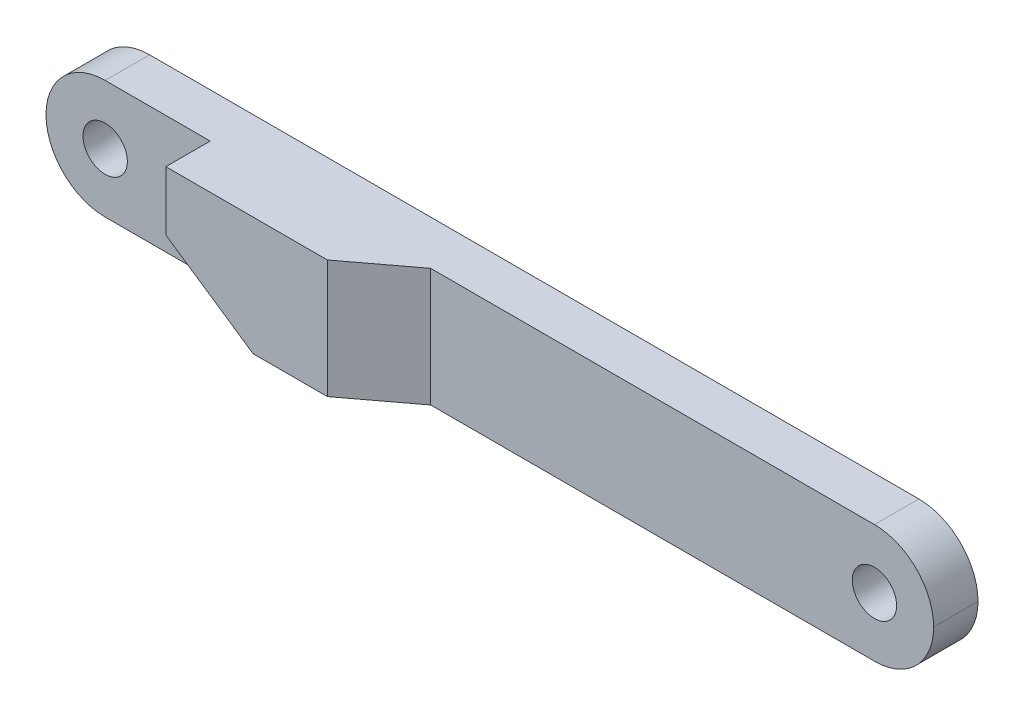
ISO-10303-21;
HEADER;
FILE_DESCRIPTION(('STEP AP214'),'2;1');
FILE_NAME('part.step','',(''),(''),'','','');
FILE_SCHEMA(('AUTOMOTIVE_DESIGN { 1 0 10303 214 1 1 1 1 }'));
ENDSEC;
DATA;
#1=APPLICATION_CONTEXT('core data for automotive mechanical design processes');
#2=APPLICATION_PROTOCOL_DEFINITION('international standard','automotive_design',2000,#1);
#3=PRODUCT_CONTEXT('',#1,'mechanical');
#4=PRODUCT('Part','Part','',(#3));
#5=PRODUCT_RELATED_PRODUCT_CATEGORY('part','',(#4));
#6=PRODUCT_DEFINITION_FORMATION('','',#4);
#7=PRODUCT_DEFINITION_CONTEXT('part definition',#1,'design');
#8=PRODUCT_DEFINITION('design','',#6,#7);
#9=PRODUCT_DEFINITION_SHAPE('','',#8);
#10=(LENGTH_UNIT() NAMED_UNIT(*) SI_UNIT(.MILLI.,.METRE.));
#11=(NAMED_UNIT(*) PLANE_ANGLE_UNIT() SI_UNIT($,.RADIAN.));
#12=(NAMED_UNIT(*) SI_UNIT($,.STERADIAN.) SOLID_ANGLE_UNIT());
#13=UNCERTAINTY_MEASURE_WITH_UNIT(LENGTH_MEASURE(1.E-05),#10,'distance_accuracy_value','');
#14=(GEOMETRIC_REPRESENTATION_CONTEXT(3) GLOBAL_UNCERTAINTY_ASSIGNED_CONTEXT((#13)) GLOBAL_UNIT_ASSIGNED_CONTEXT((#10,
#11,#12)) REPRESENTATION_CONTEXT('',''));
#15=CARTESIAN_POINT('',(0.,0.,0.));
#16=DIRECTION('',(0.,0.,1.));
#17=DIRECTION('',(1.,0.,0.));
#18=AXIS2_PLACEMENT_3D('',#15,#16,#17);
#19=CARTESIAN_POINT('',(0.,0.,3.));
#20=DIRECTION('',(0.,0.,-1.));
#21=DIRECTION('',(-1.,0.,0.));
#22=AXIS2_PLACEMENT_3D('',#19,#20,#21);
#23=PLANE('',#22);
#24=CARTESIAN_POINT('',(56.,4.,3.));
#25=DIRECTION('',(0.,0.,1.));
#26=DIRECTION('',(1.,0.,0.));
#27=AXIS2_PLACEMENT_3D('',#24,#25,#26);
#28=CIRCLE('',#27,1.5);
#29=CARTESIAN_POINT('',(57.5,4.,3.));
#30=VERTEX_POINT('',#29);
#31=EDGE_CURVE('E151',#30,#30,#28,.T.);
#32=ORIENTED_EDGE('',*,*,#31,.F.);
#33=EDGE_LOOP('',(#32));
#34=FACE_BOUND('',#33,.T.);
#35=DIRECTION('',(-1.,0.,0.));
#36=VECTOR('',#35,1.);
#37=CARTESIAN_POINT('',(0.,8.,3.));
#38=LINE('',#37,#36);
#39=CARTESIAN_POINT('',(56.,8.,3.));
#40=VERTEX_POINT('',#39);
#41=CARTESIAN_POINT('',(26.,8.,3.));
#42=VERTEX_POINT('',#41);
#43=EDGE_CURVE('E167',#40,#42,#38,.T.);
#44=ORIENTED_EDGE('',*,*,#43,.T.);
#45=DIRECTION('',(0.,-1.,0.));
#46=VECTOR('',#45,1.);
#47=CARTESIAN_POINT('',(26.,0.,3.));
#48=LINE('',#47,#46);
#49=CARTESIAN_POINT('',(26.,0.,3.));
#50=VERTEX_POINT('',#49);
#51=EDGE_CURVE('E203',#42,#50,#48,.T.);
#52=ORIENTED_EDGE('',*,*,#51,.T.);
#53=DIRECTION('',(1.,0.,0.));
#54=VECTOR('',#53,1.);
#55=CARTESIAN_POINT('',(0.,0.,3.));
#56=LINE('',#55,#54);
#57=CARTESIAN_POINT('',(56.,0.,3.));
#58=VERTEX_POINT('',#57);
#59=EDGE_CURVE('E166',#50,#58,#56,.T.);
#60=ORIENTED_EDGE('',*,*,#59,.T.);
#61=CARTESIAN_POINT('',(56.,4.,3.));
#62=DIRECTION('',(0.,0.,-1.));
#63=DIRECTION('',(-1.,0.,0.));
#64=AXIS2_PLACEMENT_3D('',#61,#62,#63);
#65=CIRCLE('',#64,4.);
#66=CARTESIAN_POINT('',(60.,4.,3.));
#67=VERTEX_POINT('',#66);
#68=EDGE_CURVE('E196',#58,#67,#65,.F.);
#69=ORIENTED_EDGE('',*,*,#68,.T.);
#70=CARTESIAN_POINT('',(56.,4.,3.));
#71=DIRECTION('',(0.,0.,-1.));
#72=DIRECTION('',(-1.,0.,0.));
#73=AXIS2_PLACEMENT_3D('',#70,#71,#72);
#74=CIRCLE('',#73,4.);
#75=EDGE_CURVE('E194',#67,#40,#74,.F.);
#76=ORIENTED_EDGE('',*,*,#75,.T.);
#77=EDGE_LOOP('',(#44,#52,#60,#69,#76));
#78=FACE_BOUND('',#77,.T.);
#79=ADVANCED_FACE('F39',(#34,#78),#23,.F.);
#80=CARTESIAN_POINT('',(4.,4.,3.));
#81=DIRECTION('',(0.,0.,1.));
#82=DIRECTION('',(1.,0.,0.));
#83=AXIS2_PLACEMENT_3D('',#80,#81,#82);
#84=CIRCLE('',#83,1.5);
#85=CARTESIAN_POINT('',(5.5,4.,3.));
#86=VERTEX_POINT('',#85);
#87=EDGE_CURVE('E156',#86,#86,#84,.T.);
#88=ORIENTED_EDGE('',*,*,#87,.F.);
#89=EDGE_LOOP('',(#88));
#90=FACE_BOUND('',#89,.T.);
#91=DIRECTION('',(0.827708498204769,-0.56115830386764,0.));
#92=VECTOR('',#91,1.);
#93=CARTESIAN_POINT('',(5.2,8.,3.));
#94=LINE('',#93,#92);
#95=CARTESIAN_POINT('',(11.1,4.,3.));
#96=VERTEX_POINT('',#95);
#97=CARTESIAN_POINT('',(17.,0.,3.));
#98=VERTEX_POINT('',#97);
#99=EDGE_CURVE('E133',#96,#98,#94,.T.);
#100=ORIENTED_EDGE('',*,*,#99,.F.);
#101=DIRECTION('',(0.,1.,0.));
#102=VECTOR('',#101,1.);
#103=CARTESIAN_POINT('',(11.1,4.,3.));
#104=LINE('',#103,#102);
#105=CARTESIAN_POINT('',(11.1,8.,3.));
#106=VERTEX_POINT('',#105);
#107=EDGE_CURVE('E121',#96,#106,#104,.T.);
#108=ORIENTED_EDGE('',*,*,#107,.T.);
#109=CARTESIAN_POINT('',(4.,8.,3.));
#110=VERTEX_POINT('',#109);
#111=EDGE_CURVE('E165',#106,#110,#38,.T.);
#112=ORIENTED_EDGE('',*,*,#111,.T.);
#113=CARTESIAN_POINT('',(4.,4.,3.));
#114=DIRECTION('',(0.,0.,-1.));
#115=DIRECTION('',(-1.,0.,0.));
#116=AXIS2_PLACEMENT_3D('',#113,#114,#115);
#117=CIRCLE('',#116,4.);
#118=CARTESIAN_POINT('',(0.,4.,3.));
#119=VERTEX_POINT('',#118);
#120=EDGE_CURVE('E192',#110,#119,#117,.F.);
#121=ORIENTED_EDGE('',*,*,#120,.T.);
#122=CARTESIAN_POINT('',(4.,4.,3.));
#123=DIRECTION('',(0.,0.,-1.));
#124=DIRECTION('',(-1.,0.,0.));
#125=AXIS2_PLACEMENT_3D('',#122,#123,#124);
#126=CIRCLE('',#125,4.);
#127=CARTESIAN_POINT('',(4.,0.,3.));
#128=VERTEX_POINT('',#127);
#129=EDGE_CURVE('E190',#119,#128,#126,.F.);
#130=ORIENTED_EDGE('',*,*,#129,.T.);
#131=EDGE_CURVE('E139',#128,#98,#56,.T.);
#132=ORIENTED_EDGE('',*,*,#131,.T.);
#133=EDGE_LOOP('',(#100,#108,#112,#121,#130,#132));
#134=FACE_BOUND('',#133,.T.);
#135=ADVANCED_FACE('F137',(#90,#134),#23,.F.);
#136=CARTESIAN_POINT('',(0.,0.,3.));
#137=DIRECTION('',(0.,1.,0.));
#138=DIRECTION('',(0.,0.,1.));
#139=AXIS2_PLACEMENT_3D('',#136,#137,#138);
#140=PLANE('',#139);
#141=DIRECTION('',(1.,0.,0.));
#142=VECTOR('',#141,1.);
#143=CARTESIAN_POINT('',(0.,0.,0.));
#144=LINE('',#143,#142);
#145=CARTESIAN_POINT('',(4.,0.,0.));
#146=VERTEX_POINT('',#145);
#147=CARTESIAN_POINT('',(56.,0.,0.));
#148=VERTEX_POINT('',#147);
#149=EDGE_CURVE('E171',#146,#148,#144,.T.);
#150=ORIENTED_EDGE('',*,*,#149,.T.);
#151=DIRECTION('',(0.,0.,-1.));
#152=VECTOR('',#151,1.);
#153=CARTESIAN_POINT('',(56.,0.,3.));
#154=LINE('',#153,#152);
#155=EDGE_CURVE('E187',#148,#58,#154,.F.);
#156=ORIENTED_EDGE('',*,*,#155,.T.);
#157=ORIENTED_EDGE('',*,*,#59,.F.);
#158=DIRECTION('',(0.798635510047289,0.,-0.601815023152053));
#159=VECTOR('',#158,1.);
#160=CARTESIAN_POINT('',(9.41671437437917,0.,15.4964020471982));
#161=LINE('',#160,#159);
#162=CARTESIAN_POINT('',(22.0188655351388,0.,6.));
#163=VERTEX_POINT('',#162);
#164=EDGE_CURVE('E11',#50,#163,#161,.F.);
#165=ORIENTED_EDGE('',*,*,#164,.T.);
#166=DIRECTION('',(1.,0.,0.));
#167=VECTOR('',#166,1.);
#168=CARTESIAN_POINT('',(17.,0.,6.));
#169=LINE('',#168,#167);
#170=CARTESIAN_POINT('',(17.,0.,6.));
#171=VERTEX_POINT('',#170);
#172=EDGE_CURVE('E62',#171,#163,#169,.T.);
#173=ORIENTED_EDGE('',*,*,#172,.F.);
#174=DIRECTION('',(0.,0.,-1.));
#175=VECTOR('',#174,1.);
#176=CARTESIAN_POINT('',(17.,0.,6.));
#177=LINE('',#176,#175);
#178=EDGE_CURVE('E149',#171,#98,#177,.T.);
#179=ORIENTED_EDGE('',*,*,#178,.T.);
#180=ORIENTED_EDGE('',*,*,#131,.F.);
#181=DIRECTION('',(0.,0.,-1.));
#182=VECTOR('',#181,1.);
#183=CARTESIAN_POINT('',(4.,0.,3.));
#184=LINE('',#183,#182);
#185=EDGE_CURVE('E185',#128,#146,#184,.T.);
#186=ORIENTED_EDGE('',*,*,#185,.T.);
#187=EDGE_LOOP('',(#150,#156,#157,#165,#173,#179,#180,#186));
#188=FACE_BOUND('',#187,.T.);
#189=ADVANCED_FACE('F223',(#188),#140,.F.);
#190=CARTESIAN_POINT('',(0.,8.,3.));
#191=DIRECTION('',(0.,-1.,0.));
#192=DIRECTION('',(0.,0.,-1.));
#193=AXIS2_PLACEMENT_3D('',#190,#191,#192);
#194=PLANE('',#193);
#195=ORIENTED_EDGE('',*,*,#111,.F.);
#196=DIRECTION('',(0.,0.,1.));
#197=VECTOR('',#196,1.);
#198=CARTESIAN_POINT('',(11.1,8.,3.));
#199=LINE('',#198,#197);
#200=CARTESIAN_POINT('',(11.1,8.,6.));
#201=VERTEX_POINT('',#200);
#202=EDGE_CURVE('E124',#106,#201,#199,.T.);
#203=ORIENTED_EDGE('',*,*,#202,.T.);
#204=DIRECTION('',(-1.,0.,0.));
#205=VECTOR('',#204,1.);
#206=CARTESIAN_POINT('',(22.,8.,6.));
#207=LINE('',#206,#205);
#208=CARTESIAN_POINT('',(22.0188655351388,8.,6.));
#209=VERTEX_POINT('',#208);
#210=EDGE_CURVE('E141',#209,#201,#207,.T.);
#211=ORIENTED_EDGE('',*,*,#210,.F.);
#212=DIRECTION('',(-0.798635510047289,0.,0.601815023152053));
#213=VECTOR('',#212,1.);
#214=CARTESIAN_POINT('',(9.41671437437917,8.,15.4964020471982));
#215=LINE('',#214,#213);
#216=EDGE_CURVE('E47',#209,#42,#215,.F.);
#217=ORIENTED_EDGE('',*,*,#216,.T.);
#218=ORIENTED_EDGE('',*,*,#43,.F.);
#219=DIRECTION('',(0.,0.,-1.));
#220=VECTOR('',#219,1.);
#221=CARTESIAN_POINT('',(56.,8.,3.));
#222=LINE('',#221,#220);
#223=CARTESIAN_POINT('',(56.,8.,0.));
#224=VERTEX_POINT('',#223);
#225=EDGE_CURVE('E201',#40,#224,#222,.T.);
#226=ORIENTED_EDGE('',*,*,#225,.T.);
#227=DIRECTION('',(-1.,0.,0.));
#228=VECTOR('',#227,1.);
#229=CARTESIAN_POINT('',(0.,8.,0.));
#230=LINE('',#229,#228);
#231=CARTESIAN_POINT('',(4.,8.,0.));
#232=VERTEX_POINT('',#231);
#233=EDGE_CURVE('E174',#224,#232,#230,.T.);
#234=ORIENTED_EDGE('',*,*,#233,.T.);
#235=DIRECTION('',(0.,0.,-1.));
#236=VECTOR('',#235,1.);
#237=CARTESIAN_POINT('',(4.,8.,3.));
#238=LINE('',#237,#236);
#239=EDGE_CURVE('E198',#232,#110,#238,.F.);
#240=ORIENTED_EDGE('',*,*,#239,.T.);
#241=EDGE_LOOP('',(#195,#203,#211,#217,#218,#226,#234,#240));
#242=FACE_BOUND('',#241,.T.);
#243=ADVANCED_FACE('F214',(#242),#194,.F.);
#244=CARTESIAN_POINT('',(0.,0.,0.));
#245=DIRECTION('',(0.,0.,-1.));
#246=DIRECTION('',(-1.,0.,0.));
#247=AXIS2_PLACEMENT_3D('',#244,#245,#246);
#248=PLANE('',#247);
#249=CARTESIAN_POINT('',(4.,4.,0.));
#250=DIRECTION('',(0.,0.,1.));
#251=DIRECTION('',(1.,0.,0.));
#252=AXIS2_PLACEMENT_3D('',#249,#250,#251);
#253=CIRCLE('',#252,1.5);
#254=CARTESIAN_POINT('',(5.5,4.,0.));
#255=VERTEX_POINT('',#254);
#256=EDGE_CURVE('E152',#255,#255,#253,.T.);
#257=ORIENTED_EDGE('',*,*,#256,.T.);
#258=EDGE_LOOP('',(#257));
#259=FACE_BOUND('',#258,.T.);
#260=CARTESIAN_POINT('',(56.,4.,0.));
#261=DIRECTION('',(0.,0.,1.));
#262=DIRECTION('',(1.,0.,0.));
#263=AXIS2_PLACEMENT_3D('',#260,#261,#262);
#264=CIRCLE('',#263,1.5);
#265=CARTESIAN_POINT('',(57.5,4.,0.));
#266=VERTEX_POINT('',#265);
#267=EDGE_CURVE('E159',#266,#266,#264,.T.);
#268=ORIENTED_EDGE('',*,*,#267,.T.);
#269=EDGE_LOOP('',(#268));
#270=FACE_BOUND('',#269,.T.);
#271=CARTESIAN_POINT('',(56.,4.,0.));
#272=DIRECTION('',(0.,0.,-1.));
#273=DIRECTION('',(-1.,0.,0.));
#274=AXIS2_PLACEMENT_3D('',#271,#272,#273);
#275=CIRCLE('',#274,4.);
#276=CARTESIAN_POINT('',(60.,4.,0.));
#277=VERTEX_POINT('',#276);
#278=EDGE_CURVE('E181',#224,#277,#275,.T.);
#279=ORIENTED_EDGE('',*,*,#278,.T.);
#280=CARTESIAN_POINT('',(56.,4.,0.));
#281=DIRECTION('',(0.,0.,-1.));
#282=DIRECTION('',(-1.,0.,0.));
#283=AXIS2_PLACEMENT_3D('',#280,#281,#282);
#284=CIRCLE('',#283,4.);
#285=EDGE_CURVE('E183',#277,#148,#284,.T.);
#286=ORIENTED_EDGE('',*,*,#285,.T.);
#287=ORIENTED_EDGE('',*,*,#149,.F.);
#288=CARTESIAN_POINT('',(4.,4.,0.));
#289=DIRECTION('',(0.,0.,-1.));
#290=DIRECTION('',(-1.,0.,0.));
#291=AXIS2_PLACEMENT_3D('',#288,#289,#290);
#292=CIRCLE('',#291,4.);
#293=CARTESIAN_POINT('',(0.,4.,0.));
#294=VERTEX_POINT('',#293);
#295=EDGE_CURVE('E170',#146,#294,#292,.T.);
#296=ORIENTED_EDGE('',*,*,#295,.T.);
#297=CARTESIAN_POINT('',(4.,4.,0.));
#298=DIRECTION('',(0.,0.,-1.));
#299=DIRECTION('',(-1.,0.,0.));
#300=AXIS2_PLACEMENT_3D('',#297,#298,#299);
#301=CIRCLE('',#300,4.);
#302=EDGE_CURVE('E179',#294,#232,#301,.T.);
#303=ORIENTED_EDGE('',*,*,#302,.T.);
#304=ORIENTED_EDGE('',*,*,#233,.F.);
#305=EDGE_LOOP('',(#279,#286,#287,#296,#303,#304));
#306=FACE_BOUND('',#305,.T.);
#307=ADVANCED_FACE('F236',(#259,#270,#306),#248,.T.);
#308=CARTESIAN_POINT('',(56.,4.,3.));
#309=DIRECTION('',(0.,0.,-1.));
#310=DIRECTION('',(-1.,0.,0.));
#311=AXIS2_PLACEMENT_3D('',#308,#309,#310);
#312=CYLINDRICAL_SURFACE('',#311,4.);
#313=ORIENTED_EDGE('',*,*,#225,.F.);
#314=ORIENTED_EDGE('',*,*,#75,.F.);
#315=DIRECTION('',(0.,0.,-1.));
#316=VECTOR('',#315,1.);
#317=CARTESIAN_POINT('',(60.,4.,3.));
#318=LINE('',#317,#316);
#319=EDGE_CURVE('E175',#277,#67,#318,.F.);
#320=ORIENTED_EDGE('',*,*,#319,.F.);
#321=ORIENTED_EDGE('',*,*,#278,.F.);
#322=EDGE_LOOP('',(#313,#314,#320,#321));
#323=FACE_BOUND('',#322,.T.);
#324=ADVANCED_FACE('F232',(#323),#312,.T.);
#325=CARTESIAN_POINT('',(56.,4.,3.));
#326=DIRECTION('',(0.,0.,-1.));
#327=DIRECTION('',(-1.,0.,0.));
#328=AXIS2_PLACEMENT_3D('',#325,#326,#327);
#329=CYLINDRICAL_SURFACE('',#328,4.);
#330=ORIENTED_EDGE('',*,*,#68,.F.);
#331=ORIENTED_EDGE('',*,*,#155,.F.);
#332=ORIENTED_EDGE('',*,*,#285,.F.);
#333=ORIENTED_EDGE('',*,*,#319,.T.);
#334=EDGE_LOOP('',(#330,#331,#332,#333));
#335=FACE_BOUND('',#334,.T.);
#336=ADVANCED_FACE('F227',(#335),#329,.T.);
#337=CARTESIAN_POINT('',(4.,4.,3.));
#338=DIRECTION('',(0.,0.,-1.));
#339=DIRECTION('',(-1.,0.,0.));
#340=AXIS2_PLACEMENT_3D('',#337,#338,#339);
#341=CYLINDRICAL_SURFACE('',#340,4.);
#342=ORIENTED_EDGE('',*,*,#185,.F.);
#343=ORIENTED_EDGE('',*,*,#129,.F.);
#344=DIRECTION('',(0.,0.,-1.));
#345=VECTOR('',#344,1.);
#346=CARTESIAN_POINT('',(0.,4.,3.));
#347=LINE('',#346,#345);
#348=EDGE_CURVE('E155',#294,#119,#347,.F.);
#349=ORIENTED_EDGE('',*,*,#348,.F.);
#350=ORIENTED_EDGE('',*,*,#295,.F.);
#351=EDGE_LOOP('',(#342,#343,#349,#350));
#352=FACE_BOUND('',#351,.T.);
#353=ADVANCED_FACE('F247',(#352),#341,.T.);
#354=CARTESIAN_POINT('',(4.,4.,3.));
#355=DIRECTION('',(0.,0.,-1.));
#356=DIRECTION('',(-1.,0.,0.));
#357=AXIS2_PLACEMENT_3D('',#354,#355,#356);
#358=CYLINDRICAL_SURFACE('',#357,4.);
#359=ORIENTED_EDGE('',*,*,#120,.F.);
#360=ORIENTED_EDGE('',*,*,#239,.F.);
#361=ORIENTED_EDGE('',*,*,#302,.F.);
#362=ORIENTED_EDGE('',*,*,#348,.T.);
#363=EDGE_LOOP('',(#359,#360,#361,#362));
#364=FACE_BOUND('',#363,.T.);
#365=ADVANCED_FACE('F243',(#364),#358,.T.);
#366=CARTESIAN_POINT('',(56.,4.,0.));
#367=DIRECTION('',(0.,0.,1.));
#368=DIRECTION('',(1.,0.,0.));
#369=AXIS2_PLACEMENT_3D('',#366,#367,#368);
#370=CYLINDRICAL_SURFACE('',#369,1.5);
#371=ORIENTED_EDGE('',*,*,#267,.F.);
#372=EDGE_LOOP('',(#371));
#373=FACE_BOUND('',#372,.T.);
#374=ORIENTED_EDGE('',*,*,#31,.T.);
#375=EDGE_LOOP('',(#374));
#376=FACE_BOUND('',#375,.T.);
#377=ADVANCED_FACE('F253',(#373,#376),#370,.F.);
#378=CARTESIAN_POINT('',(4.,4.,0.));
#379=DIRECTION('',(0.,0.,1.));
#380=DIRECTION('',(1.,0.,0.));
#381=AXIS2_PLACEMENT_3D('',#378,#379,#380);
#382=CYLINDRICAL_SURFACE('',#381,1.5);
#383=ORIENTED_EDGE('',*,*,#256,.F.);
#384=EDGE_LOOP('',(#383));
#385=FACE_BOUND('',#384,.T.);
#386=ORIENTED_EDGE('',*,*,#87,.T.);
#387=EDGE_LOOP('',(#386));
#388=FACE_BOUND('',#387,.T.);
#389=ADVANCED_FACE('F308',(#385,#388),#382,.F.);
#390=CARTESIAN_POINT('',(5.2,8.,6.));
#391=DIRECTION('',(0.56115830386764,0.827708498204769,0.));
#392=DIRECTION('',(-0.827708498204769,0.56115830386764,0.));
#393=AXIS2_PLACEMENT_3D('',#390,#391,#392);
#394=PLANE('',#393);
#395=DIRECTION('',(0.827708498204769,-0.56115830386764,0.));
#396=VECTOR('',#395,1.);
#397=CARTESIAN_POINT('',(5.2,8.,6.));
#398=LINE('',#397,#396);
#399=CARTESIAN_POINT('',(11.1,4.,6.));
#400=VERTEX_POINT('',#399);
#401=EDGE_CURVE('E135',#400,#171,#398,.T.);
#402=ORIENTED_EDGE('',*,*,#401,.F.);
#403=DIRECTION('',(0.,0.,1.));
#404=VECTOR('',#403,1.);
#405=CARTESIAN_POINT('',(11.1,4.,3.));
#406=LINE('',#405,#404);
#407=EDGE_CURVE('E54',#96,#400,#406,.T.);
#408=ORIENTED_EDGE('',*,*,#407,.F.);
#409=ORIENTED_EDGE('',*,*,#99,.T.);
#410=ORIENTED_EDGE('',*,*,#178,.F.);
#411=EDGE_LOOP('',(#402,#408,#409,#410));
#412=FACE_BOUND('',#411,.T.);
#413=ADVANCED_FACE('F131',(#412),#394,.F.);
#414=CARTESIAN_POINT('',(0.,0.,6.));
#415=DIRECTION('',(0.,0.,-1.));
#416=DIRECTION('',(-1.,0.,0.));
#417=AXIS2_PLACEMENT_3D('',#414,#415,#416);
#418=PLANE('',#417);
#419=ORIENTED_EDGE('',*,*,#210,.T.);
#420=DIRECTION('',(0.,1.,0.));
#421=VECTOR('',#420,1.);
#422=CARTESIAN_POINT('',(11.1,4.,6.));
#423=LINE('',#422,#421);
#424=EDGE_CURVE('E127',#400,#201,#423,.T.);
#425=ORIENTED_EDGE('',*,*,#424,.F.);
#426=ORIENTED_EDGE('',*,*,#401,.T.);
#427=ORIENTED_EDGE('',*,*,#172,.T.);
#428=DIRECTION('',(0.,-1.,0.));
#429=VECTOR('',#428,1.);
#430=CARTESIAN_POINT('',(22.0188655351388,0.,6.));
#431=LINE('',#430,#429);
#432=EDGE_CURVE('E210',#163,#209,#431,.F.);
#433=ORIENTED_EDGE('',*,*,#432,.T.);
#434=EDGE_LOOP('',(#419,#425,#426,#427,#433));
#435=FACE_BOUND('',#434,.T.);
#436=ADVANCED_FACE('F341',(#435),#418,.F.);
#437=CARTESIAN_POINT('',(22.,0.,6.01421620041123));
#438=DIRECTION('',(0.601815023152053,0.,0.798635510047289));
#439=DIRECTION('',(0.,-1.,0.));
#440=AXIS2_PLACEMENT_3D('',#437,#438,#439);
#441=PLANE('',#440);
#442=ORIENTED_EDGE('',*,*,#164,.F.);
#443=ORIENTED_EDGE('',*,*,#51,.F.);
#444=ORIENTED_EDGE('',*,*,#216,.F.);
#445=ORIENTED_EDGE('',*,*,#432,.F.);
#446=EDGE_LOOP('',(#442,#443,#444,#445));
#447=FACE_BOUND('',#446,.T.);
#448=ADVANCED_FACE('F41',(#447),#441,.T.);
#449=CARTESIAN_POINT('',(11.1,4.,3.));
#450=DIRECTION('',(1.,0.,0.));
#451=DIRECTION('',(0.,0.,-1.));
#452=AXIS2_PLACEMENT_3D('',#449,#450,#451);
#453=PLANE('',#452);
#454=ORIENTED_EDGE('',*,*,#424,.T.);
#455=ORIENTED_EDGE('',*,*,#202,.F.);
#456=ORIENTED_EDGE('',*,*,#107,.F.);
#457=ORIENTED_EDGE('',*,*,#407,.T.);
#458=EDGE_LOOP('',(#454,#455,#456,#457));
#459=FACE_BOUND('',#458,.T.);
#460=ADVANCED_FACE('F122',(#459),#453,.F.);
#461=CLOSED_SHELL('',(#79,#135,#189,#243,#307,#324,#336,#353,#365,#377,#389,#413,#436,#448,#460));
#462=MANIFOLD_SOLID_BREP('B2',#461);
#463=ADVANCED_BREP_SHAPE_REPRESENTATION('',(#18,#462),#14);
#464=SHAPE_DEFINITION_REPRESENTATION(#9,#463);
ENDSEC;
END-ISO-10303-21;
